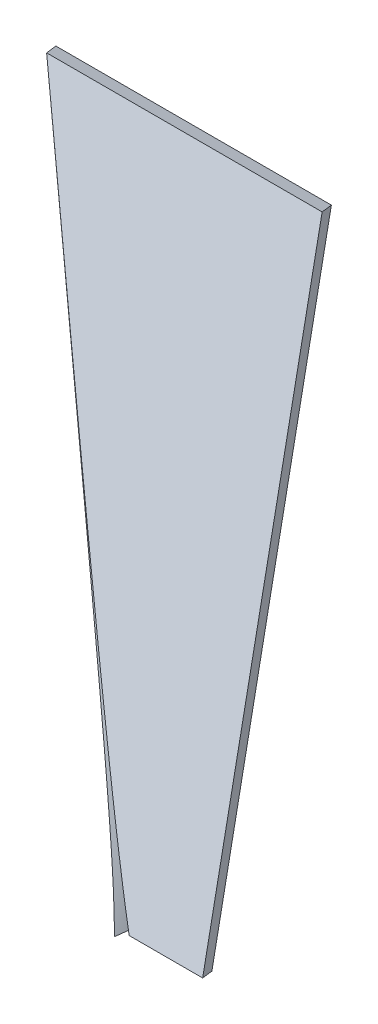
ISO-10303-21;
HEADER;
FILE_DESCRIPTION(('STEP AP214'),'2;1');
FILE_NAME('part.step','',(''),(''),'','','');
FILE_SCHEMA(('AUTOMOTIVE_DESIGN { 1 0 10303 214 1 1 1 1 }'));
ENDSEC;
DATA;
#1=APPLICATION_CONTEXT('core data for automotive mechanical design processes');
#2=APPLICATION_PROTOCOL_DEFINITION('international standard','automotive_design',2000,#1);
#3=PRODUCT_CONTEXT('',#1,'mechanical');
#4=PRODUCT('Part','Part','',(#3));
#5=PRODUCT_RELATED_PRODUCT_CATEGORY('part','',(#4));
#6=PRODUCT_DEFINITION_FORMATION('','',#4);
#7=PRODUCT_DEFINITION_CONTEXT('part definition',#1,'design');
#8=PRODUCT_DEFINITION('design','',#6,#7);
#9=PRODUCT_DEFINITION_SHAPE('','',#8);
#10=(LENGTH_UNIT() NAMED_UNIT(*) SI_UNIT(.MILLI.,.METRE.));
#11=(NAMED_UNIT(*) PLANE_ANGLE_UNIT() SI_UNIT($,.RADIAN.));
#12=(NAMED_UNIT(*) SI_UNIT($,.STERADIAN.) SOLID_ANGLE_UNIT());
#13=UNCERTAINTY_MEASURE_WITH_UNIT(LENGTH_MEASURE(1.E-05),#10,'distance_accuracy_value','');
#14=(GEOMETRIC_REPRESENTATION_CONTEXT(3) GLOBAL_UNCERTAINTY_ASSIGNED_CONTEXT((#13)) GLOBAL_UNIT_ASSIGNED_CONTEXT((#10,
#11,#12)) REPRESENTATION_CONTEXT('',''));
#15=CARTESIAN_POINT('',(0.,0.,0.));
#16=DIRECTION('',(0.,0.,1.));
#17=DIRECTION('',(1.,0.,0.));
#18=AXIS2_PLACEMENT_3D('',#15,#16,#17);
#19=CARTESIAN_POINT('',(-123.381202334399,324.271488093634,69.1234463208217));
#20=DIRECTION('',(0.843459103537485,0.255501074852039,-0.472541999624579));
#21=DIRECTION('',(-0.488764700454802,0.,-0.872415650701733));
#22=AXIS2_PLACEMENT_3D('',#19,#20,#21);
#23=PLANE('',#22);
#24=DIRECTION('',(-0.387960554738975,-0.318717725023183,-0.864815367418199));
#25=VECTOR('',#24,1.);
#26=CARTESIAN_POINT('',(-34.1521528405303,31.3336923468589,70.0019553588377));
#27=LINE('',#26,#25);
#28=CARTESIAN_POINT('',(-34.0152185482186,31.4461867373069,70.3072000000032));
#29=VERTEX_POINT('',#28);
#30=CARTESIAN_POINT('',(-33.3047050812152,32.0298474219822,71.8910062702968));
#31=VERTEX_POINT('',#30);
#32=EDGE_CURVE('E240',#29,#31,#27,.F.);
#33=ORIENTED_EDGE('',*,*,#32,.T.);
#34=CARTESIAN_POINT('',(-32.9494717056199,31.1550520167966,72.0520790649205));
#35=CARTESIAN_POINT('',(-33.0217351112646,31.3334714928379,72.0195637341081));
#36=CARTESIAN_POINT('',(-33.0940787549624,31.5118259127623,71.9868700076734));
#37=CARTESIAN_POINT('',(-33.2389239864866,31.86840576023,71.9211308884856));
#38=CARTESIAN_POINT('',(-33.3114255743107,32.0466311877752,71.8880854957379));
#39=CARTESIAN_POINT('',(-33.5188396051001,32.5557735485744,71.7931546069079));
#40=CARTESIAN_POINT('',(-33.65394252885,32.8865337639719,71.7308443775052));
#41=CARTESIAN_POINT('',(-33.7893055271391,33.217076926867,71.667952571469));
#42=B_SPLINE_CURVE_WITH_KNOTS('',3,(#34,#35,#36,#37,#38,#39,#40,#41),.UNSPECIFIED.,.F.,.F.,(4,2,
2,4),(0.,0.585674468911849,1.17134892877345,2.25939009845252),.UNSPECIFIED.);
#43=CARTESIAN_POINT('',(-33.3927857996483,32.2463857015753,71.8508239375012));
#44=VERTEX_POINT('',#43);
#45=EDGE_CURVE('E243',#31,#44,#42,.T.);
#46=ORIENTED_EDGE('',*,*,#45,.T.);
#47=CARTESIAN_POINT('',(-34.1362659945285,31.8457880720925,70.3072000000032));
#48=CARTESIAN_POINT('',(-33.4008510465077,32.2305280127676,71.8278984812759));
#49=CARTESIAN_POINT('',(-32.675552810292,32.6440389759493,73.3460955859604));
#50=CARTESIAN_POINT('',(-31.2457472539815,33.5250552881878,76.3745737500911));
#51=CARTESIAN_POINT('',(-30.5412192715755,33.992504535625,77.8848613566601));
#52=CARTESIAN_POINT('',(-29.1490369139104,34.9807564935332,80.9041661421829));
#53=CARTESIAN_POINT('',(-28.461467214201,35.5017780249997,82.4131504957719));
#54=CARTESIAN_POINT('',(-27.1052939282951,36.5930848562766,85.4239024997981));
#55=CARTESIAN_POINT('',(-26.4367107376989,37.1634206547954,86.9256610497099));
#56=CARTESIAN_POINT('',(-25.7778148306981,37.756655616399,88.4225098418489));
#57=B_SPLINE_CURVE_WITH_KNOTS('',3,(#47,#48,#49,#50,#51,#52,#53,#54,#55,#56),.UNSPECIFIED.,.F.,
.F.,(4,2,2,2,4),(0.,5.19693593737323,10.3885144154312,15.60221094477,20.8213110986353),.UNSPECIFIED.);
#58=CARTESIAN_POINT('',(-25.7781455054091,37.7568049608551,88.4220003776111));
#59=VERTEX_POINT('',#58);
#60=EDGE_CURVE('E115',#44,#59,#57,.T.);
#61=ORIENTED_EDGE('',*,*,#60,.T.);
#62=CARTESIAN_POINT('',(-198.565683191778,367.504926406604,-41.7002368798003));
#63=CARTESIAN_POINT('',(-196.391942958606,363.237558496975,-40.1275853455756));
#64=CARTESIAN_POINT('',(-194.218123316799,358.970306323216,-38.5547294939026));
#65=CARTESIAN_POINT('',(-189.870302682651,350.436072913127,-35.4085475962406));
#66=CARTESIAN_POINT('',(-187.696301690472,346.169091676564,-33.8352215506639));
#67=CARTESIAN_POINT('',(-183.348093491618,337.635435029915,-30.6880360201834));
#68=CARTESIAN_POINT('',(-181.173886285084,333.368759619625,-29.1141765356413));
#69=CARTESIAN_POINT('',(-176.82523508757,324.835757847769,-25.9658461916486));
#70=CARTESIAN_POINT('',(-174.650791096702,320.569431486041,-24.391375332487));
#71=CARTESIAN_POINT('',(-170.301630248169,312.037179072691,-21.2417301176563));
#72=CARTESIAN_POINT('',(-168.126913390574,307.771253020966,-19.6665557621689));
#73=CARTESIAN_POINT('',(-163.777912871444,299.241332982585,-16.5159356223208));
#74=CARTESIAN_POINT('',(-161.603629318887,294.977338836725,-14.9404901185615));
#75=CARTESIAN_POINT('',(-157.254693823609,286.449887298494,-11.7886513368109));
#76=CARTESIAN_POINT('',(-155.080041880801,282.186429906251,-10.2122580585947));
#77=CARTESIAN_POINT('',(-150.730305826574,273.660143526837,-7.05836033168241));
#78=CARTESIAN_POINT('',(-148.555221714933,269.397314539991,-5.48085588241426));
#79=CARTESIAN_POINT('',(-144.204542813441,260.872398192105,-2.32453446059811));
#80=CARTESIAN_POINT('',(-142.02894802317,256.610310831681,-0.745717486965329));
#81=CARTESIAN_POINT('',(-137.677150584701,248.087018226186,2.41347840552884));
#82=CARTESIAN_POINT('',(-135.500947935782,243.825812982174,3.99385732625225));
#83=CARTESIAN_POINT('',(-131.963932358705,236.902035680339,6.56356635983935));
#84=CARTESIAN_POINT('',(-130.603341056029,234.23913829748,7.55232498291659));
#85=CARTESIAN_POINT('',(-127.881838728658,228.913816490601,9.53066864013981));
#86=CARTESIAN_POINT('',(-126.520927704185,226.251392066255,10.5202536737141));
#87=CARTESIAN_POINT('',(-123.798746302376,220.927082627701,12.5003568204905));
#88=CARTESIAN_POINT('',(-122.437475925886,218.265197612249,13.4908749315111));
#89=CARTESIAN_POINT('',(-119.714528720861,212.942044414839,15.4729701648106));
#90=CARTESIAN_POINT('',(-118.352851893942,210.280776230501,16.4645472829193));
#91=CARTESIAN_POINT('',(-115.628748958811,204.958386643153,18.4491183051892));
#92=CARTESIAN_POINT('',(-114.266322754184,202.297265382317,19.4421124583191));
#93=CARTESIAN_POINT('',(-111.54092989473,196.975815616351,21.4294940747539));
#94=CARTESIAN_POINT('',(-110.177963239276,194.315487112149,22.4238815396787));
#95=CARTESIAN_POINT('',(-107.451398216418,188.995728085737,24.4142695717732));
#96=CARTESIAN_POINT('',(-106.087799844141,186.336297570737,25.4102701515369));
#97=CARTESIAN_POINT('',(-103.359863494544,181.01846431011,27.404147171385));
#98=CARTESIAN_POINT('',(-101.995525506648,178.360061580165,28.4020236388254));
#99=CARTESIAN_POINT('',(-99.4208460742078,173.346035876343,30.2866134742845));
#100=CARTESIAN_POINT('',(-98.2105944246548,170.990279434249,31.1730943980438));
#101=CARTESIAN_POINT('',(-95.7893293644931,166.279894759137,32.9480259602735));
#102=CARTESIAN_POINT('',(-94.578315952635,163.925266527979,33.8364766019805));
#103=CARTESIAN_POINT('',(-92.155427928175,159.217360256369,35.6156451183273));
#104=CARTESIAN_POINT('',(-90.9435533289332,156.864082195951,36.5063629583251));
#105=CARTESIAN_POINT('',(-88.5188182347864,152.159136010287,38.2904288867219));
#106=CARTESIAN_POINT('',(-87.3059577722275,149.807467836541,39.1837768911618));
#107=CARTESIAN_POINT('',(-84.8790945526264,145.106048579961,40.9735483885068));
#108=CARTESIAN_POINT('',(-83.6650918523434,142.756297411689,41.8699717339051));
#109=CARTESIAN_POINT('',(-81.2362975867718,138.060143352779,43.6660368982034));
#110=CARTESIAN_POINT('',(-80.0215067496201,135.713739361041,44.5656768220645));
#111=CARTESIAN_POINT('',(-77.5902517654575,131.023489446536,46.3693265624248));
#112=CARTESIAN_POINT('',(-76.373787623968,128.679643515374,47.2733363645295));
#113=CARTESIAN_POINT('',(-73.9387867963676,123.994893044001,49.0866457317223));
#114=CARTESIAN_POINT('',(-72.7202500003565,121.653988671979,49.9959455839152));
#115=CARTESIAN_POINT('',(-70.2806169871876,116.975639343596,51.8209841900027));
#116=CARTESIAN_POINT('',(-69.0595204900914,114.638194819045,52.7367236770487));
#117=CARTESIAN_POINT('',(-66.6141660811783,109.967458344839,54.5760908629357));
#118=CARTESIAN_POINT('',(-65.3899076356912,107.634167226059,55.4997199635964));
#119=CARTESIAN_POINT('',(-63.13858123307,103.354944073592,57.2044480829556));
#120=CARTESIAN_POINT('',(-62.1120559447349,101.40815674701,57.98411601787));
#121=CARTESIAN_POINT('',(-60.0559508039787,97.5193255431052,59.551468860313));
#122=CARTESIAN_POINT('',(-59.0263708445219,95.5772818364525,60.339154051174));
#123=CARTESIAN_POINT('',(-56.9636800236796,91.6992532051745,61.9241028337566));
#124=CARTESIAN_POINT('',(-55.9305695115266,89.7632677156186,62.721365496664));
#125=CARTESIAN_POINT('',(-53.8601731639442,85.8989451873686,64.3274790026788));
#126=CARTESIAN_POINT('',(-52.8228882686167,83.9706066016442,65.1363273312895));
#127=CARTESIAN_POINT('',(-50.7432776449727,80.123536069197,66.7682158340396));
#128=CARTESIAN_POINT('',(-49.70095356407,78.2048013518431,67.5912515695781));
#129=CARTESIAN_POINT('',(-47.6101019760208,74.3793598666982,69.2548992357588));
#130=CARTESIAN_POINT('',(-46.5615768335327,72.4726490231182,70.0955047418692));
#131=CARTESIAN_POINT('',(-44.9815336051272,69.6213793093581,71.374119910262));
#132=CARTESIAN_POINT('',(-44.4530563427489,68.6713791785714,71.8037598229073));
#133=CARTESIAN_POINT('',(-43.3938234493871,66.7755373125456,72.6693548228825));
#134=CARTESIAN_POINT('',(-42.8630678275506,65.8296955606424,73.1053098848752));
#135=CARTESIAN_POINT('',(-41.799050959994,63.9428086418378,73.9842858863928));
#136=CARTESIAN_POINT('',(-41.2657898813231,63.0017631636319,74.4273063594243));
#137=CARTESIAN_POINT('',(-40.1964355069118,61.1250947551447,75.3213345872457));
#138=CARTESIAN_POINT('',(-39.6603422270639,60.1894717944971,75.7723422972495));
#139=CARTESIAN_POINT('',(-38.5849331915889,58.324345507908,76.6834184986909));
#140=CARTESIAN_POINT('',(-38.045617093419,57.394842855364,77.1434879656496));
#141=CARTESIAN_POINT('',(-36.9634551363018,55.5430108776974,78.0738058926117));
#142=CARTESIAN_POINT('',(-36.4206092883765,54.620681530195,78.5440543208409));
#143=CARTESIAN_POINT('',(-35.3306842307064,52.7838137415553,79.4963199777866));
#144=CARTESIAN_POINT('',(-34.7836028731056,51.8692798250369,79.9783434867358));
#145=CARTESIAN_POINT('',(-33.6850632441318,50.0498535204079,80.955416158741));
#146=CARTESIAN_POINT('',(-33.1336050218134,49.1449610245044,81.4504651759542));
#147=CARTESIAN_POINT('',(-32.024993651234,47.3450255666465,82.4560539046406));
#148=CARTESIAN_POINT('',(-31.4678331710747,46.4499995093375,82.9666158433685));
#149=CARTESIAN_POINT('',(-30.3481610277176,44.673100561651,84.0044031123184));
#150=CARTESIAN_POINT('',(-29.7856495991107,43.7912270989638,84.5316277143648));
#151=CARTESIAN_POINT('',(-28.6528565930692,42.0398866859155,85.6066543063021));
#152=CARTESIAN_POINT('',(-28.0825554462674,41.1704705221339,86.154518686386));
#153=CARTESIAN_POINT('',(-27.2222526744909,39.8798239683515,86.992261412371));
#154=CARTESIAN_POINT('',(-26.9346527813219,39.4518201716758,87.2741904643584));
#155=CARTESIAN_POINT('',(-26.3577816347494,38.6006843129013,87.8436659683274));
#156=CARTESIAN_POINT('',(-26.0685103383996,38.1775523768268,88.1312125651061));
#157=CARTESIAN_POINT('',(-25.778376008594,37.7570445086757,88.4217184450829));
#158=B_SPLINE_CURVE_WITH_KNOTS('',3,(#62,#63,#64,#65,#66,#67,#68,#69,#70,#71,#72,#73,#74,#75,
#76,#77,#78,#79,#80,#81,#82,#83,#84,#85,#86,#87,#88,#89,#90,#91,#92,#93,#94,#95,#96,#97,#98,#99,
#100,#101,#102,#103,#104,#105,#106,#107,#108,#109,#110,#111,#112,#113,#114,#115,#116,#117,#118,
#119,#120,#121,#122,#123,#124,#125,#126,#127,#128,#129,#130,#131,#132,#133,#134,#135,#136,#137,
#138,#139,#140,#141,#142,#143,#144,#145,#146,#147,#148,#149,#150,#151,#152,#153,#154,#155,#156,
#157),.UNSPECIFIED.,.F.,.F.,(4,2,2,2,2,2,2,2,2,2,2,2,2,2,2,2,2,2,2,2,2,2,2,2,2,2,2,2,2,2,2,2,2,
2,2,2,2,2,2,2,2,2,2,2,2,2,2,4),(0.,15.122145190384,30.2442771587507,45.3663988994723,
60.4885135048806,75.6106242088661,90.7275236534162,105.844426689367,120.961337514116,
136.078260845048,151.195202218886,160.643951898423,170.092695046855,179.541416158831,
188.990100200462,198.440723080558,207.89135695789,217.342064977599,226.792911902406,
235.17153341656,243.550168708426,251.928676736938,260.306920148347,268.684767169025,
277.058300061281,285.431805389608,293.805769489867,302.180702918432,310.557156702998,
317.561749610778,324.566590928738,331.570758321537,338.573427929425,345.573945109435,
352.571945788352,356.078690642587,359.585421431256,363.091921638925,366.598402191139,
370.10526231067,373.61211148491,377.120873733813,380.62959671285,384.143609106811,
387.6574681466,391.18296944634,392.946009402351,394.70909486234),.UNSPECIFIED.);
#159=CARTESIAN_POINT('',(-197.538744145659,365.488915423754,-40.9572592937362));
#160=VERTEX_POINT('',#159);
#161=EDGE_CURVE('E111',#160,#59,#158,.T.);
#162=ORIENTED_EDGE('',*,*,#161,.F.);
#163=CARTESIAN_POINT('',(-197.53874414566,365.488915423754,-40.9572592937362));
#164=DIRECTION('',(-0.387960639279976,-0.318717517346954,-0.864815406029325));
#165=VECTOR('',#164,1.);
#166=LINE('',#163,#165);
#167=CARTESIAN_POINT('',(-202.216329949319,361.646186737307,-51.3842000000199));
#168=VERTEX_POINT('',#167);
#169=EDGE_CURVE('E96',#160,#168,#166,.T.);
#170=ORIENTED_EDGE('',*,*,#169,.T.);
#171=DIRECTION('',(-0.431238885415035,0.846576369371357,-0.311995952742996));
#172=VECTOR('',#171,1.);
#173=CARTESIAN_POINT('',(-157.697288261715,274.249702551088,-19.1752341741541));
#174=LINE('',#173,#172);
#175=EDGE_CURVE('E119',#29,#168,#174,.T.);
#176=ORIENTED_EDGE('',*,*,#175,.F.);
#177=EDGE_LOOP('',(#33,#46,#61,#162,#170,#176));
#178=FACE_BOUND('',#177,.T.);
#179=ADVANCED_FACE('F38',(#178),#23,.F.);
#180=CARTESIAN_POINT('',(-6.22609191666298,361.769121183095,2.73946802342179));
#181=DIRECTION('',(-0.915166256682498,0.0180699960866787,0.402671327351691));
#182=DIRECTION('',(0.402737084534614,0.,0.915315705503057));
#183=AXIS2_PLACEMENT_3D('',#180,#181,#182);
#184=PLANE('',#183);
#185=DIRECTION('',(0.386982631378429,0.318859858880358,0.865201036410744));
#186=VECTOR('',#185,1.);
#187=CARTESIAN_POINT('',(12.3298869272427,396.55978730235,43.3510968786001));
#188=LINE('',#187,#186);
#189=CARTESIAN_POINT('',(-30.0428252259831,361.646186737307,-51.3842000000199));
#190=VERTEX_POINT('',#189);
#191=CARTESIAN_POINT('',(-25.3791172761131,365.488915423754,-40.9572592937362));
#192=VERTEX_POINT('',#191);
#193=EDGE_CURVE('E250',#190,#192,#188,.T.);
#194=ORIENTED_EDGE('',*,*,#193,.T.);
#195=DIRECTION('',(0.132448179386108,-0.930040822643861,0.342755813945199));
#196=VECTOR('',#195,1.);
#197=CARTESIAN_POINT('',(-22.6011953632259,345.982563633365,-33.7684184146768));
#198=LINE('',#197,#196);
#199=CARTESIAN_POINT('',(21.6450431354347,35.2889154237541,80.7341407062869));
#200=VERTEX_POINT('',#199);
#201=EDGE_CURVE('E107',#192,#200,#198,.T.);
#202=ORIENTED_EDGE('',*,*,#201,.T.);
#203=DIRECTION('',(0.386982631378429,0.318859858880358,0.865201036410744));
#204=VECTOR('',#203,1.);
#205=CARTESIAN_POINT('',(9.20807304861993,25.0412965250574,52.9280364100997));
#206=LINE('',#205,#204);
#207=CARTESIAN_POINT('',(16.9813351855648,31.4461867373068,70.3072000000032));
#208=VERTEX_POINT('',#207);
#209=EDGE_CURVE('E242',#200,#208,#206,.F.);
#210=ORIENTED_EDGE('',*,*,#209,.T.);
#211=DIRECTION('',(0.132448179386108,-0.930040822643861,0.342755813945199));
#212=VECTOR('',#211,1.);
#213=CARTESIAN_POINT('',(-27.1830901220726,341.565349077537,-43.9836389824834));
#214=LINE('',#213,#212);
#215=EDGE_CURVE('E228',#190,#208,#214,.T.);
#216=ORIENTED_EDGE('',*,*,#215,.F.);
#217=EDGE_LOOP('',(#194,#202,#210,#216));
#218=FACE_BOUND('',#217,.T.);
#219=ADVANCED_FACE('F188',(#218),#184,.F.);
#220=CARTESIAN_POINT('',(-35.0241286863038,31.3959645393255,70.3072000000032));
#221=CARTESIAN_POINT('',(-35.0202777592816,31.3883635709842,79.8282122567529));
#222=CARTESIAN_POINT('',(-35.0160380597837,31.3821256341456,89.3492268798435));
#223=CARTESIAN_POINT('',(-35.0119556806026,31.3769951537859,98.8702406093947));
#224=CARTESIAN_POINT('',(-34.9249999999667,31.4461867373069,70.3072000000032));
#225=CARTESIAN_POINT('',(-34.9249999999667,31.4461867373069,79.828213536467));
#226=CARTESIAN_POINT('',(-34.9249999999667,31.4461867373069,89.3492270729309));
#227=CARTESIAN_POINT('',(-34.9249999999667,31.4461867373069,98.8702406093947));
#228=CARTESIAN_POINT('',(-25.0121313662584,36.4684065354482,70.3072000000032));
#229=CARTESIAN_POINT('',(-25.3972240684742,37.2285033695766,79.8283415078825));
#230=CARTESIAN_POINT('',(-25.8211940182613,37.8522970534396,89.3492463816683));
#231=CARTESIAN_POINT('',(-26.2294319363748,38.3653450894073,98.8702406093947));
#232=B_SPLINE_SURFACE_WITH_KNOTS('',1,3,((#220,#221,#222,#223),(#224,#225,#226,#227),(#228,#229,
#230,#231)),.UNSPECIFIED.,.F.,.F.,.F.,(2,1,2),(4,4),(-0.01,0.,1.),(-0.0142815203046956,
0.0142815203046959),.UNSPECIFIED.);
#233=CARTESIAN_POINT('',(-25.4170338814331,37.198103329077,80.030450378742));
#234=CARTESIAN_POINT('',(-25.7460007936552,36.9661719667684,79.6880409756934));
#235=CARTESIAN_POINT('',(-26.0761708702981,36.7368695417805,79.3450049536451));
#236=CARTESIAN_POINT('',(-26.7371316892983,36.2848581434162,78.6595575881282));
#237=CARTESIAN_POINT('',(-27.0679095259765,36.0621203244834,78.3171528201523));
#238=CARTESIAN_POINT('',(-27.7300903268686,35.6232354004242,77.6329687132211));
#239=CARTESIAN_POINT('',(-28.0614807879858,35.4070597256082,77.2911956038062));
#240=CARTESIAN_POINT('',(-28.7248901955737,34.9812967913682,76.6082760445149));
#241=CARTESIAN_POINT('',(-29.0568970553841,34.7716812697937,76.2671354754682));
#242=CARTESIAN_POINT('',(-29.7215423617126,34.3590364766983,75.5854819821841));
#243=CARTESIAN_POINT('',(-30.0541691465543,34.1559792845498,75.2449745919259));
#244=CARTESIAN_POINT('',(-30.7200568480355,33.7564491987218,74.5645884334522));
#245=CARTESIAN_POINT('',(-31.0533065371901,33.5599487601308,74.2247148538115));
#246=CARTESIAN_POINT('',(-31.7204423507896,33.1735304452563,73.5455970444382));
#247=CARTESIAN_POINT('',(-32.0543176886644,32.9835854345268,73.2063576613404));
#248=CARTESIAN_POINT('',(-32.7227058727473,32.6102763860889,72.5285094355236));
#249=CARTESIAN_POINT('',(-33.0572083837471,32.4268856599618,72.18990509842));
#250=CARTESIAN_POINT('',(-33.392797092993,32.2463729576099,71.850841901135));
#251=B_SPLINE_CURVE_WITH_KNOTS('',3,(#233,#234,#235,#236,#237,#238,#239,#240,#241,#242,#243,
#244,#245,#246,#247,#248,#249,#250),.UNSPECIFIED.,.F.,.F.,(4,2,2,2,2,2,2,2,4),(0.,
1.58533261228215,3.1621323663579,4.73061394653157,6.29099433656781,7.84349278583699,
9.38833077415274,10.9257319752179,12.455922218598),.UNSPECIFIED.);
#252=CARTESIAN_POINT('',(-25.4173149649188,37.1987150096691,80.0303061050468));
#253=VERTEX_POINT('',#252);
#254=EDGE_CURVE('E55',#253,#44,#251,.T.);
#255=CARTESIAN_POINT('',(-25.4169649834911,37.198136485999,80.0303617266529));
#256=CARTESIAN_POINT('',(-25.4318423048873,37.2227524269256,80.3800044637329));
#257=CARTESIAN_POINT('',(-25.4467474742244,37.2471970924979,80.7296580706932));
#258=CARTESIAN_POINT('',(-25.4766071649191,37.2957448077287,81.4289649792754));
#259=CARTESIAN_POINT('',(-25.4915616831463,37.3198478785611,81.7786182795609));
#260=CARTESIAN_POINT('',(-25.5215146623564,37.3677149346013,82.477924605108));
#261=CARTESIAN_POINT('',(-25.5365131205858,37.3914789405306,82.8275776290693));
#262=CARTESIAN_POINT('',(-25.5665485700301,37.4386703978103,83.5268834348143));
#263=CARTESIAN_POINT('',(-25.581585558858,37.4620978694429,83.8765362153317));
#264=CARTESIAN_POINT('',(-25.6116926598526,37.5086187889598,84.5758415663224));
#265=CARTESIAN_POINT('',(-25.6267627699885,37.5317122566997,84.9254941355622));
#266=CARTESIAN_POINT('',(-25.6569307038702,37.5775676993605,85.6247990964607));
#267=CARTESIAN_POINT('',(-25.6720285259317,37.6003296937226,85.9744514869172));
#268=CARTESIAN_POINT('',(-25.7022464740441,37.6455247203752,86.6737561221167));
#269=CARTESIAN_POINT('',(-25.7173665987479,37.6679577717043,87.0234083656875));
#270=CARTESIAN_POINT('',(-25.7476237420741,37.7124974436674,87.7227127410446));
#271=CARTESIAN_POINT('',(-25.7627607596779,37.7346040829485,88.0723648716873));
#272=CARTESIAN_POINT('',(-25.777903948662,37.7565493926153,88.4220268575352));
#273=B_SPLINE_CURVE_WITH_KNOTS('',3,(#255,#256,#257,#258,#259,#260,#261,#262,#263,#264,#265,
#266,#267,#268,#269,#270,#271,#272),.UNSPECIFIED.,.F.,.F.,(4,2,2,2,2,2,2,2,4),(0.,
1.05247128418409,2.10487704227906,3.15721820586026,4.20949567856105,5.2617103369783,
6.31386303157892,7.36595458760674,8.41798580598977),.UNSPECIFIED.);
#274=EDGE_CURVE('E47',#253,#59,#273,.T.);
#275=ORIENTED_EDGE('',*,*,#60,.F.);
#276=ORIENTED_EDGE('',*,*,#254,.F.);
#277=ORIENTED_EDGE('',*,*,#274,.T.);
#278=EDGE_LOOP('',(#275,#276,#277));
#279=FACE_BOUND('',#278,.T.);
#280=ADVANCED_FACE('F176',(#279),#232,.T.);
#281=CARTESIAN_POINT('',(-34.9249999999667,31.4461867373069,70.3072000000032));
#282=DIRECTION('',(0.,0.938307375143637,-0.345802356485694));
#283=DIRECTION('',(-1.,0.,0.));
#284=AXIS2_PLACEMENT_3D('',#281,#282,#283);
#285=PLANE('',#284);
#286=ORIENTED_EDGE('',*,*,#209,.F.);
#287=DIRECTION('',(1.,0.,0.));
#288=VECTOR('',#287,1.);
#289=CARTESIAN_POINT('',(0.,35.2889154237541,80.7341407062869));
#290=LINE('',#289,#288);
#291=CARTESIAN_POINT('',(-24.2574045943365,35.2889154237541,80.7341407062869));
#292=VERTEX_POINT('',#291);
#293=EDGE_CURVE('E63',#200,#292,#290,.F.);
#294=ORIENTED_EDGE('',*,*,#293,.T.);
#295=CARTESIAN_POINT('',(-33.3047335938797,32.0298279717492,71.8910426065875));
#296=CARTESIAN_POINT('',(-32.9277855561334,32.1656103588951,72.2595114780373));
#297=CARTESIAN_POINT('',(-32.5508358699473,32.3013938705426,72.62797824873));
#298=CARTESIAN_POINT('',(-31.7969301456121,32.5729642462312,73.3649105546568));
#299=CARTESIAN_POINT('',(-31.4199741074363,32.7087511102906,73.7333760898568));
#300=CARTESIAN_POINT('',(-30.666055661692,32.9803282000018,74.4703059214082));
#301=CARTESIAN_POINT('',(-30.2890932540967,33.1161184256719,74.8387702177254));
#302=CARTESIAN_POINT('',(-29.5351620520844,33.3877022478033,75.5756975681211));
#303=CARTESIAN_POINT('',(-29.1581932576403,33.5234958442829,75.9441606221653));
#304=CARTESIAN_POINT('',(-28.4042492645012,33.7950864172321,76.6810854846251));
#305=CARTESIAN_POINT('',(-28.0272740657789,33.9308833937201,77.0495472930062));
#306=CARTESIAN_POINT('',(-27.2733172466539,34.2024807358846,77.7864696607499));
#307=CARTESIAN_POINT('',(-26.896335626224,34.3382811015797,78.1549302200778));
#308=CARTESIAN_POINT('',(-26.1423659462545,34.6098852313572,78.8918500863252));
#309=CARTESIAN_POINT('',(-25.7653778866874,34.7456889954583,79.2603093932097));
#310=CARTESIAN_POINT('',(-25.0113953110145,35.0172999312461,79.9972267511806));
#311=CARTESIAN_POINT('',(-24.6344007948812,35.1531071029518,80.3656848022319));
#312=CARTESIAN_POINT('',(-24.2574045943366,35.2889154237542,80.7341407062869));
#313=B_SPLINE_CURVE_WITH_KNOTS('',3,(#295,#296,#297,#298,#299,#300,#301,#302,#303,#304,#305,
#306,#307,#308,#309,#310,#311,#312),.UNSPECIFIED.,.F.,.F.,(4,2,2,2,2,2,2,2,4),(0.,
1.63299231516896,3.26599782651473,4.8990165704336,6.53204858332334,8.16509390158328,
9.7981525616143,11.4312245998188,13.0643100526007),.UNSPECIFIED.);
#314=EDGE_CURVE('E118',#292,#31,#313,.F.);
#315=ORIENTED_EDGE('',*,*,#314,.T.);
#316=ORIENTED_EDGE('',*,*,#32,.F.);
#317=DIRECTION('',(-1.,0.,0.));
#318=VECTOR('',#317,1.);
#319=CARTESIAN_POINT('',(-34.9249999999667,31.4461867373069,70.3072000000032));
#320=LINE('',#319,#318);
#321=EDGE_CURVE('E147',#208,#29,#320,.T.);
#322=ORIENTED_EDGE('',*,*,#321,.F.);
#323=EDGE_LOOP('',(#286,#294,#315,#316,#322));
#324=FACE_BOUND('',#323,.T.);
#325=ADVANCED_FACE('F187',(#324),#285,.F.);
#326=CARTESIAN_POINT('',(-25.4173149649188,37.1987150096691,80.0303061050466));
#327=CARTESIAN_POINT('',(-25.0317912514901,36.5615276952786,80.265134137604));
#328=CARTESIAN_POINT('',(-24.645173966298,35.9249175390839,80.499749465168));
#329=CARTESIAN_POINT('',(-24.2574045943366,35.2889154237542,80.7341407062869));
#330=B_SPLINE_CURVE_WITH_KNOTS('',3,(#326,#327,#328,#329),.UNSPECIFIED.,.F.,.F.,(4,4),(0.,1.),.UNSPECIFIED.);
#331=DIRECTION('',(0.670569515513733,0.318916403487621,0.669797620516973));
#332=VECTOR('',#331,1.);
#333=SURFACE_OF_LINEAR_EXTRUSION('',#330,#332);
#334=ORIENTED_EDGE('',*,*,#45,.F.);
#335=ORIENTED_EDGE('',*,*,#314,.F.);
#336=CARTESIAN_POINT('',(-24.2574045943366,35.2889154237542,80.7341407062869));
#337=CARTESIAN_POINT('',(-24.645173966298,35.9249175390839,80.499749465168));
#338=CARTESIAN_POINT('',(-25.0317912514901,36.5615276952786,80.265134137604));
#339=CARTESIAN_POINT('',(-25.4173149649188,37.1987150096691,80.0303061050466));
#340=B_SPLINE_CURVE_WITH_KNOTS('',3,(#336,#337,#338,#339),.UNSPECIFIED.,.F.,.F.,(4,4),(0.,1.),.UNSPECIFIED.);
#341=EDGE_CURVE('E130',#253,#292,#340,.F.);
#342=ORIENTED_EDGE('',*,*,#341,.F.);
#343=ORIENTED_EDGE('',*,*,#254,.T.);
#344=EDGE_LOOP('',(#334,#335,#342,#343));
#345=FACE_BOUND('',#344,.T.);
#346=ADVANCED_FACE('F189',(#345),#333,.T.);
#347=CARTESIAN_POINT('',(-34.9249999999667,31.4461867373069,70.3072000000032));
#348=CARTESIAN_POINT('',(-202.216329949319,361.646186737307,-51.3842000000199));
#349=CARTESIAN_POINT('',(-34.9249999999667,31.4461867373069,75.067706768235));
#350=CARTESIAN_POINT('',(-218.125065214804,361.646186737307,-35.5770333081413));
#351=CARTESIAN_POINT('',(-34.9249999999667,31.4461867373069,79.8282135364669));
#352=CARTESIAN_POINT('',(-234.03380048029,361.646186737307,-19.7698666162628));
#353=CARTESIAN_POINT('',(-34.9249999999667,31.4461867373069,89.3492270729307));
#354=CARTESIAN_POINT('',(-265.851271011261,361.646186737307,11.8444667674942));
#355=CARTESIAN_POINT('',(-34.9249999999667,31.4461867373069,94.1097338411627));
#356=CARTESIAN_POINT('',(-281.760006276746,361.646186737307,27.6516334593727));
#357=CARTESIAN_POINT('',(-34.9249999999667,31.4461867373069,98.8702406093947));
#358=CARTESIAN_POINT('',(-297.668741542232,361.646186737307,43.4588001512512));
#359=B_SPLINE_SURFACE_WITH_KNOTS('',3,1,((#347,#348),(#349,#350),(#351,#352),(#353,#354),(#355,
#356),(#357,#358)),.UNSPECIFIED.,.F.,.F.,.F.,(4,2,4),(2,2),(0.,0.5,1.),(0.,1.),.UNSPECIFIED.);
#360=OFFSET_SURFACE('',#359,-11.1125,.F.);
#361=CARTESIAN_POINT('',(-233.819016836319,436.7711302341,-67.227497075));
#362=CARTESIAN_POINT('',(-231.830666629548,432.861647558717,-65.786702344403));
#363=CARTESIAN_POINT('',(-229.842154236954,428.952237503691,-64.3459343772004));
#364=CARTESIAN_POINT('',(-225.864775939312,421.133575810695,-61.4644568255734));
#365=CARTESIAN_POINT('',(-223.875910034272,417.224324172722,-60.023747241148));
#366=CARTESIAN_POINT('',(-219.897795535644,409.405992420759,-57.1423912854816));
#367=CARTESIAN_POINT('',(-217.908546942065,405.496912306765,-55.7017449142394));
#368=CARTESIAN_POINT('',(-213.929633649408,397.678938611746,-52.8205209163286));
#369=CARTESIAN_POINT('',(-211.939968950338,393.770045030719,-51.3799432896588));
#370=CARTESIAN_POINT('',(-207.960186302776,385.952461079771,-48.498862927428));
#371=CARTESIAN_POINT('',(-205.97006835429,382.043770709847,-47.058360191866));
#372=CARTESIAN_POINT('',(-201.989709454719,374.227342412818,-44.1777057325528));
#373=CARTESIAN_POINT('',(-199.999468596141,370.319604444239,-42.7375539935168));
#374=CARTESIAN_POINT('',(-196.018445117691,362.504371434502,-39.8573400435433));
#375=CARTESIAN_POINT('',(-194.027662497814,358.596876393347,-38.4172778326065));
#376=CARTESIAN_POINT('',(-190.045502452889,350.782153039134,-35.5372517102957));
#377=CARTESIAN_POINT('',(-188.054125027825,346.874924726084,-34.0972877989242));
#378=CARTESIAN_POINT('',(-184.070715230139,339.060761813796,-31.2174682210183));
#379=CARTESIAN_POINT('',(-182.078682857485,335.153827214573,-29.7776125544891));
#380=CARTESIAN_POINT('',(-178.093894704522,327.340282447686,-26.8980207869381));
#381=CARTESIAN_POINT('',(-176.101138924156,323.433672280047,-25.4582846859257));
#382=CARTESIAN_POINT('',(-172.114813429294,315.620787431096,-22.5789361235156));
#383=CARTESIAN_POINT('',(-170.121243709768,311.714512752044,-21.1393236629506));
#384=CARTESIAN_POINT('',(-166.133213086473,303.902363896218,-18.2602463423147));
#385=CARTESIAN_POINT('',(-164.138752182698,299.996489719448,-16.8207814822448));
#386=CARTESIAN_POINT('',(-160.148835879442,292.185188999485,-13.9420167322947));
#387=CARTESIAN_POINT('',(-158.153380480046,288.279762456253,-12.5027168424003));
#388=CARTESIAN_POINT('',(-154.161355372867,280.469411556766,-9.62430213782735));
#389=CARTESIAN_POINT('',(-152.16478566526,276.564487200432,-8.18518732311943));
#390=CARTESIAN_POINT('',(-148.170392250622,268.755204168953,-5.3071661689792));
#391=CARTESIAN_POINT('',(-146.172568543847,264.850845493692,-3.86825982950415));
#392=CARTESIAN_POINT('',(-142.175138862732,257.042056176499,-0.990420628067227));
#393=CARTESIAN_POINT('',(-140.175532630032,253.137625651005,0.448512190982635));
#394=CARTESIAN_POINT('',(-136.174708155868,245.329491797466,3.32610982885264));
#395=CARTESIAN_POINT('',(-134.17348991441,241.425788469419,4.76477464767382));
#396=CARTESIAN_POINT('',(-130.169211448301,233.61921218902,7.6417982599355));
#397=CARTESIAN_POINT('',(-128.166151223106,229.716339236912,9.08015705328545));
#398=CARTESIAN_POINT('',(-124.157913782545,221.91154723426,11.9565230905714));
#399=CARTESIAN_POINT('',(-122.152736565754,218.009628184358,13.3945303342698));
#400=CARTESIAN_POINT('',(-118.139934155235,210.206892779549,16.2701384361506));
#401=CARTESIAN_POINT('',(-116.132308958652,206.306076425934,17.7077392938563));
#402=CARTESIAN_POINT('',(-112.295096520162,198.856888201099,20.4530516619476));
#403=CARTESIAN_POINT('',(-110.465754107486,195.308405301345,21.7608040906189));
#404=CARTESIAN_POINT('',(-106.804343452674,188.212676194199,24.3758531792607));
#405=CARTESIAN_POINT('',(-104.972275209585,184.66542998724,25.6831498390717));
#406=CARTESIAN_POINT('',(-101.304970344063,177.572382585032,28.2972106163013));
#407=CARTESIAN_POINT('',(-99.4697337237399,174.026581388823,29.6039747340737));
#408=CARTESIAN_POINT('',(-95.7955499290969,166.936677759141,32.2168769102133));
#409=CARTESIAN_POINT('',(-93.9566027598774,163.392575323341,33.5230149694378));
#410=CARTESIAN_POINT('',(-90.274328101336,156.306381145857,36.1345500697712));
#411=CARTESIAN_POINT('',(-88.4310006190336,152.764289400961,37.4399471120634));
#412=CARTESIAN_POINT('',(-84.739129904432,145.682504057621,40.0498573874442));
#413=CARTESIAN_POINT('',(-82.8905866777407,142.142810456603,41.3543706214812));
#414=CARTESIAN_POINT('',(-79.1880417991614,135.067855485773,43.961763641885));
#415=CARTESIAN_POINT('',(-77.3340428839755,131.53259285536,45.2646438928321));
#416=CARTESIAN_POINT('',(-73.6184528981002,124.465585420181,47.8691079406742));
#417=CARTESIAN_POINT('',(-71.7568618353247,120.933840611754,49.1706917389187));
#418=CARTESIAN_POINT('',(-68.0243700323278,113.874672374939,51.7722667406563));
#419=CARTESIAN_POINT('',(-66.1534692702045,110.347248956742,53.0722579403936));
#420=CARTESIAN_POINT('',(-62.4001175812212,103.297773186842,55.6702608952858));
#421=CARTESIAN_POINT('',(-60.5176665471808,99.7757208853595,56.9682726319322));
#422=CARTESIAN_POINT('',(-56.7382747736553,92.7383593520209,59.5618110247193));
#423=CARTESIAN_POINT('',(-54.8413337062271,89.2230502750453,60.8573376237803));
#424=CARTESIAN_POINT('',(-51.9821004500068,83.9565857335435,62.7982323636526));
#425=CARTESIAN_POINT('',(-51.0266954018657,82.2021376272633,63.4448139695903));
#426=CARTESIAN_POINT('',(-49.1106716879945,78.6957502287291,64.7370525870042));
#427=CARTESIAN_POINT('',(-48.1500530259447,76.9438109347054,65.3827095991325));
#428=CARTESIAN_POINT('',(-46.2221670327112,73.4414580598267,66.6734613394053));
#429=CARTESIAN_POINT('',(-45.254895179391,71.6910466698641,67.3185552601218));
#430=CARTESIAN_POINT('',(-43.3136136105899,68.1935174171667,68.6075293100969));
#431=CARTESIAN_POINT('',(-42.3396039018488,66.4463995511397,69.251409440569));
#432=CARTESIAN_POINT('',(-40.3839280962077,62.9560083839866,70.5377528314793));
#433=CARTESIAN_POINT('',(-39.4022622386282,61.2127349648562,71.1802161354066));
#434=CARTESIAN_POINT('',(-37.4301974531931,57.7306624677833,72.4634937764434));
#435=CARTESIAN_POINT('',(-36.4397990058655,55.9918631503629,73.1043082018098));
#436=CARTESIAN_POINT('',(-34.4490095929397,52.5194596215315,74.3840224561663));
#437=CARTESIAN_POINT('',(-33.4486193209621,50.7858550602197,75.0229224141084));
#438=CARTESIAN_POINT('',(-31.4363765984087,47.3246664286768,76.2985035474718));
#439=CARTESIAN_POINT('',(-30.4245249572805,45.5970819444139,76.9351848754799));
#440=CARTESIAN_POINT('',(-28.3868934519272,42.147595108848,78.2064534469568));
#441=CARTESIAN_POINT('',(-27.3611044543273,40.4256975037086,78.8410389412817));
#442=CARTESIAN_POINT('',(-25.2943485531081,36.9899448202143,80.1072459494836));
#443=CARTESIAN_POINT('',(-24.2533817247976,35.2760897020102,80.7388674780465));
#444=CARTESIAN_POINT('',(-22.1540144469248,31.8576804733815,81.9986827560744));
#445=CARTESIAN_POINT('',(-21.0956131194887,30.1531268371001,82.6268763307995));
#446=CARTESIAN_POINT('',(-18.958815871136,26.754752120278,83.8793081206686));
#447=CARTESIAN_POINT('',(-17.8804171242068,25.060932602757,84.5035457597797));
#448=CARTESIAN_POINT('',(-15.7007388286538,21.6856216862949,85.7474776521468));
#449=CARTESIAN_POINT('',(-14.5994528731724,20.0041339225835,86.3671705656809));
#450=CARTESIAN_POINT('',(-12.9281099680244,17.4927159511378,87.2927246811577));
#451=CARTESIAN_POINT('',(-12.3676194604928,16.657174297211,87.6006539168473));
#452=CARTESIAN_POINT('',(-11.2398525865663,14.9901230457028,88.215026420384));
#453=CARTESIAN_POINT('',(-10.6725761600674,14.1586134839262,88.5214696750357));
#454=CARTESIAN_POINT('',(-10.1017118188657,13.3292704621671,88.8271144763625));
#455=B_SPLINE_CURVE_WITH_KNOTS('',3,(#361,#362,#363,#364,#365,#366,#367,#368,#369,#370,#371,
#372,#373,#374,#375,#376,#377,#378,#379,#380,#381,#382,#383,#384,#385,#386,#387,#388,#389,#390,
#391,#392,#393,#394,#395,#396,#397,#398,#399,#400,#401,#402,#403,#404,#405,#406,#407,#408,#409,
#410,#411,#412,#413,#414,#415,#416,#417,#418,#419,#420,#421,#422,#423,#424,#425,#426,#427,#428,
#429,#430,#431,#432,#433,#434,#435,#436,#437,#438,#439,#440,#441,#442,#443,#444,#445,#446,#447,
#448,#449,#450,#451,#452,#453,#454),.UNSPECIFIED.,.F.,.F.,(4,2,2,2,2,2,2,2,2,2,2,2,2,2,2,2,2,2,
2,2,2,2,2,2,2,2,2,2,2,2,2,2,2,2,2,2,2,2,2,2,2,2,2,2,2,2,4),(0.,13.8499576580788,
27.6999150623845,41.5498722050465,55.3998291066869,69.2497858238369,83.0971539728496,
96.9445222348979,110.791890844776,124.639260116618,138.486630468225,152.334087727938,
166.18154507316,180.029001233265,193.876455199566,207.723906322756,221.573879819044,
235.423853262178,249.273830797592,263.123817663162,276.973820702685,289.576834046776,
302.179851800538,314.782861166616,327.385853222516,339.988825095943,352.591783424332,
365.189237189189,377.786677826148,390.384148113744,402.981735476553,415.57960880186,
421.878855577076,428.178097906342,434.482156823877,440.786209436421,447.090065776716,
453.39357737316,459.696654387249,465.999288994511,472.306274755022,478.613229232365,
484.920502258426,491.228673518436,497.538635077932,500.695172279271,503.851737459298),.UNSPECIFIED.);
#456=EDGE_CURVE('E11',#160,#253,#455,.T.);
#457=ORIENTED_EDGE('',*,*,#456,.F.);
#458=ORIENTED_EDGE('',*,*,#161,.T.);
#459=ORIENTED_EDGE('',*,*,#274,.F.);
#460=EDGE_LOOP('',(#457,#458,#459));
#461=FACE_BOUND('',#460,.T.);
#462=ADVANCED_FACE('F121',(#461),#360,.F.);
#463=CARTESIAN_POINT('',(252.903016686641,361.646186737307,-51.3842000000199));
#464=DIRECTION('',(0.,0.938307375143637,-0.345802356485694));
#465=DIRECTION('',(-1.,0.,0.));
#466=AXIS2_PLACEMENT_3D('',#463,#464,#465);
#467=PLANE('',#466);
#468=ORIENTED_EDGE('',*,*,#193,.F.);
#469=DIRECTION('',(-1.,0.,0.));
#470=VECTOR('',#469,1.);
#471=CARTESIAN_POINT('',(252.903016686641,361.646186737307,-51.3842000000199));
#472=LINE('',#471,#470);
#473=EDGE_CURVE('E104',#190,#168,#472,.T.);
#474=ORIENTED_EDGE('',*,*,#473,.T.);
#475=ORIENTED_EDGE('',*,*,#169,.F.);
#476=DIRECTION('',(1.,0.,0.));
#477=VECTOR('',#476,1.);
#478=CARTESIAN_POINT('',(0.,365.488915423754,-40.9572592937362));
#479=LINE('',#478,#477);
#480=EDGE_CURVE('E102',#192,#160,#479,.F.);
#481=ORIENTED_EDGE('',*,*,#480,.F.);
#482=EDGE_LOOP('',(#468,#474,#475,#481));
#483=FACE_BOUND('',#482,.T.);
#484=ADVANCED_FACE('F100',(#483),#467,.T.);
#485=CARTESIAN_POINT('',(0.,348.816340498756,-34.8127741809915));
#486=DIRECTION('',(0.,0.345802356485694,0.938307375143637));
#487=DIRECTION('',(0.,-0.938307375143637,0.345802356485694));
#488=AXIS2_PLACEMENT_3D('',#485,#486,#487);
#489=PLANE('',#488);
#490=ORIENTED_EDGE('',*,*,#201,.F.);
#491=ORIENTED_EDGE('',*,*,#480,.T.);
#492=ORIENTED_EDGE('',*,*,#456,.T.);
#493=ORIENTED_EDGE('',*,*,#341,.T.);
#494=ORIENTED_EDGE('',*,*,#293,.F.);
#495=EDGE_LOOP('',(#490,#491,#492,#493,#494));
#496=FACE_BOUND('',#495,.T.);
#497=ADVANCED_FACE('F126',(#496),#489,.T.);
#498=CARTESIAN_POINT('',(0.,344.973611812309,-45.2397148872752));
#499=DIRECTION('',(0.,0.345802356485694,0.938307375143637));
#500=DIRECTION('',(0.,-0.938307375143637,0.345802356485694));
#501=AXIS2_PLACEMENT_3D('',#498,#499,#500);
#502=PLANE('',#501);
#503=ORIENTED_EDGE('',*,*,#473,.F.);
#504=ORIENTED_EDGE('',*,*,#215,.T.);
#505=ORIENTED_EDGE('',*,*,#321,.T.);
#506=ORIENTED_EDGE('',*,*,#175,.T.);
#507=EDGE_LOOP('',(#503,#504,#505,#506));
#508=FACE_BOUND('',#507,.T.);
#509=ADVANCED_FACE('F40',(#508),#502,.F.);
#510=CLOSED_SHELL('',(#179,#219,#280,#325,#346,#462,#484,#497,#509));
#511=MANIFOLD_SOLID_BREP('B2',#510);
#512=ADVANCED_BREP_SHAPE_REPRESENTATION('',(#18,#511),#14);
#513=SHAPE_DEFINITION_REPRESENTATION(#9,#512);
ENDSEC;
END-ISO-10303-21;
